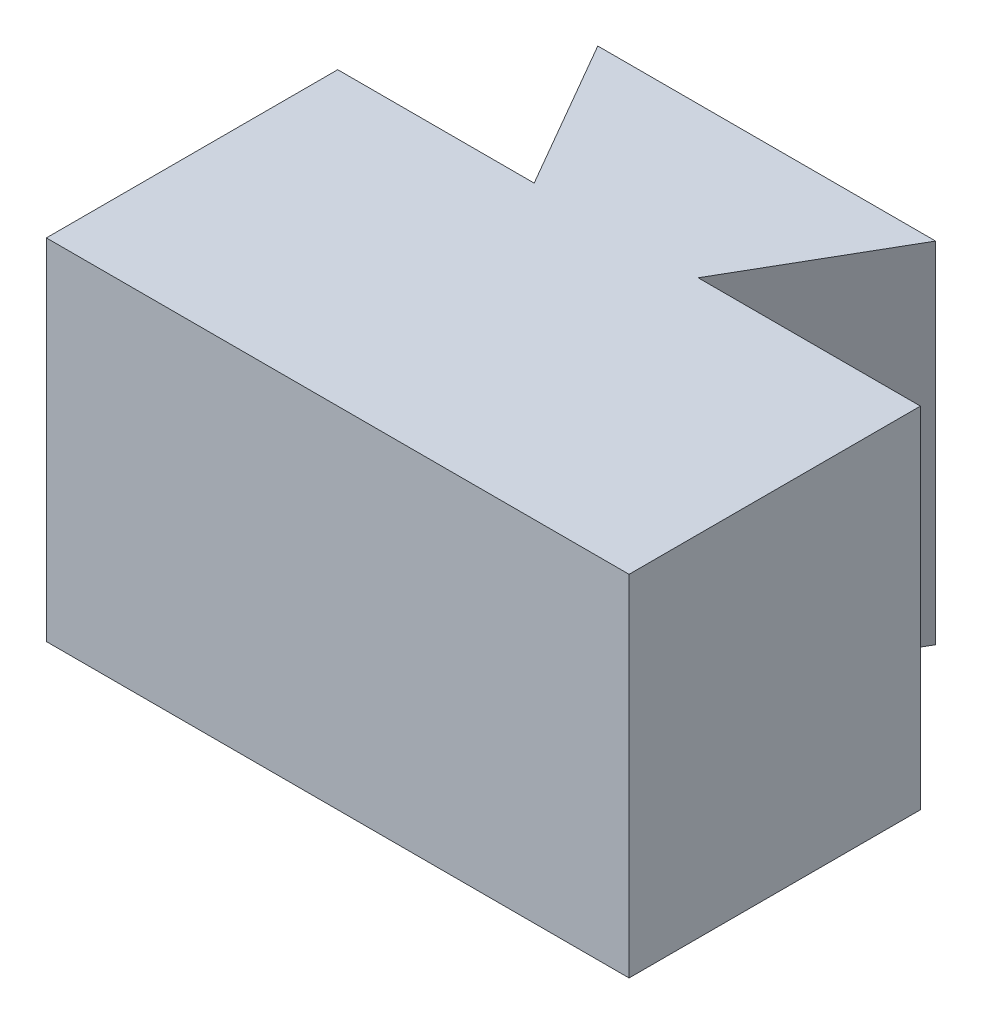
ISO-10303-21;
HEADER;
FILE_DESCRIPTION(('STEP AP214'),'2;1');
FILE_NAME('part.step','',(''),(''),'','','');
FILE_SCHEMA(('AUTOMOTIVE_DESIGN { 1 0 10303 214 1 1 1 1 }'));
ENDSEC;
DATA;
#1=APPLICATION_CONTEXT('core data for automotive mechanical design processes');
#2=APPLICATION_PROTOCOL_DEFINITION('international standard','automotive_design',2000,#1);
#3=PRODUCT_CONTEXT('',#1,'mechanical');
#4=PRODUCT('Part','Part','',(#3));
#5=PRODUCT_RELATED_PRODUCT_CATEGORY('part','',(#4));
#6=PRODUCT_DEFINITION_FORMATION('','',#4);
#7=PRODUCT_DEFINITION_CONTEXT('part definition',#1,'design');
#8=PRODUCT_DEFINITION('design','',#6,#7);
#9=PRODUCT_DEFINITION_SHAPE('','',#8);
#10=(LENGTH_UNIT() NAMED_UNIT(*) SI_UNIT(.MILLI.,.METRE.));
#11=(NAMED_UNIT(*) PLANE_ANGLE_UNIT() SI_UNIT($,.RADIAN.));
#12=(NAMED_UNIT(*) SI_UNIT($,.STERADIAN.) SOLID_ANGLE_UNIT());
#13=UNCERTAINTY_MEASURE_WITH_UNIT(LENGTH_MEASURE(1.E-05),#10,'distance_accuracy_value','');
#14=(GEOMETRIC_REPRESENTATION_CONTEXT(3) GLOBAL_UNCERTAINTY_ASSIGNED_CONTEXT((#13)) GLOBAL_UNIT_ASSIGNED_CONTEXT((#10,
#11,#12)) REPRESENTATION_CONTEXT('',''));
#15=CARTESIAN_POINT('',(0.,0.,0.));
#16=DIRECTION('',(0.,0.,1.));
#17=DIRECTION('',(1.,0.,0.));
#18=AXIS2_PLACEMENT_3D('',#15,#16,#17);
#19=CARTESIAN_POINT('',(-8.1439266494471,-0.00999999999999959,0.));
#20=DIRECTION('',(-0.866025403784436,0.,0.500000000000004));
#21=DIRECTION('',(0.500000000000004,0.,0.866025403784436));
#22=AXIS2_PLACEMENT_3D('',#19,#20,#21);
#23=PLANE('',#22);
#24=DIRECTION('',(0.,1.,0.));
#25=VECTOR('',#24,1.);
#26=CARTESIAN_POINT('',(-15.6020026458164,-0.00999999999999959,-12.9177665524214));
#27=LINE('',#26,#25);
#28=CARTESIAN_POINT('',(-15.6020026458164,0.,-12.9177665524214));
#29=VERTEX_POINT('',#28);
#30=CARTESIAN_POINT('',(-15.6020026458164,30.,-12.9177665524214));
#31=VERTEX_POINT('',#30);
#32=EDGE_CURVE('E11',#29,#31,#27,.T.);
#33=ORIENTED_EDGE('',*,*,#32,.F.);
#34=DIRECTION('',(0.500000000000004,0.,0.866025403784436));
#35=VECTOR('',#34,1.);
#36=CARTESIAN_POINT('',(-6.10794498708529,0.,3.52642368248916));
#37=LINE('',#36,#35);
#38=CARTESIAN_POINT('',(-8.1439266494471,0.,0.));
#39=VERTEX_POINT('',#38);
#40=EDGE_CURVE('E159',#29,#39,#37,.T.);
#41=ORIENTED_EDGE('',*,*,#40,.T.);
#42=DIRECTION('',(0.,1.,0.));
#43=VECTOR('',#42,1.);
#44=CARTESIAN_POINT('',(-8.1439266494471,-0.00999999999999959,0.));
#45=LINE('',#44,#43);
#46=CARTESIAN_POINT('',(-8.1439266494471,30.,0.));
#47=VERTEX_POINT('',#46);
#48=EDGE_CURVE('E56',#39,#47,#45,.T.);
#49=ORIENTED_EDGE('',*,*,#48,.T.);
#50=DIRECTION('',(0.500000000000004,0.,0.866025403784436));
#51=VECTOR('',#50,1.);
#52=CARTESIAN_POINT('',(-6.10794498708529,30.,3.52642368248916));
#53=LINE('',#52,#51);
#54=EDGE_CURVE('E184',#31,#47,#53,.T.);
#55=ORIENTED_EDGE('',*,*,#54,.F.);
#56=EDGE_LOOP('',(#33,#41,#49,#55));
#57=FACE_BOUND('',#56,.T.);
#58=ADVANCED_FACE('F45',(#57),#23,.T.);
#59=CARTESIAN_POINT('',(-15.6020026458164,-0.00999999999999959,-12.9177665524214));
#60=DIRECTION('',(0.,0.,-1.));
#61=DIRECTION('',(-1.,0.,0.));
#62=AXIS2_PLACEMENT_3D('',#59,#60,#61);
#63=PLANE('',#62);
#64=DIRECTION('',(0.,1.,0.));
#65=VECTOR('',#64,1.);
#66=CARTESIAN_POINT('',(13.3868545971668,-0.00999999999999959,-12.9177665524214));
#67=LINE('',#66,#65);
#68=CARTESIAN_POINT('',(13.3868545971668,0.,-12.9177665524214));
#69=VERTEX_POINT('',#68);
#70=CARTESIAN_POINT('',(13.3868545971668,30.,-12.9177665524214));
#71=VERTEX_POINT('',#70);
#72=EDGE_CURVE('E179',#69,#71,#67,.T.);
#73=ORIENTED_EDGE('',*,*,#72,.F.);
#74=DIRECTION('',(-1.,0.,0.));
#75=VECTOR('',#74,1.);
#76=CARTESIAN_POINT('',(0.,0.,-12.9177665524214));
#77=LINE('',#76,#75);
#78=EDGE_CURVE('E152',#69,#29,#77,.T.);
#79=ORIENTED_EDGE('',*,*,#78,.T.);
#80=ORIENTED_EDGE('',*,*,#32,.T.);
#81=DIRECTION('',(-1.,0.,0.));
#82=VECTOR('',#81,1.);
#83=CARTESIAN_POINT('',(0.,30.,-12.9177665524214));
#84=LINE('',#83,#82);
#85=EDGE_CURVE('E189',#71,#31,#84,.T.);
#86=ORIENTED_EDGE('',*,*,#85,.F.);
#87=EDGE_LOOP('',(#73,#79,#80,#86));
#88=FACE_BOUND('',#87,.T.);
#89=ADVANCED_FACE('F209',(#88),#63,.T.);
#90=CARTESIAN_POINT('',(-8.1439266494471,-0.00999999999999959,0.));
#91=DIRECTION('',(0.,0.,-1.));
#92=DIRECTION('',(-1.,0.,0.));
#93=AXIS2_PLACEMENT_3D('',#90,#91,#92);
#94=PLANE('',#93);
#95=ORIENTED_EDGE('',*,*,#48,.F.);
#96=DIRECTION('',(-1.,0.,0.));
#97=VECTOR('',#96,1.);
#98=CARTESIAN_POINT('',(0.,0.,0.));
#99=LINE('',#98,#97);
#100=CARTESIAN_POINT('',(-25.,0.,0.));
#101=VERTEX_POINT('',#100);
#102=EDGE_CURVE('E146',#39,#101,#99,.T.);
#103=ORIENTED_EDGE('',*,*,#102,.T.);
#104=DIRECTION('',(0.,1.,0.));
#105=VECTOR('',#104,1.);
#106=CARTESIAN_POINT('',(-25.,-0.00999999999999959,0.));
#107=LINE('',#106,#105);
#108=CARTESIAN_POINT('',(-25.,30.,0.));
#109=VERTEX_POINT('',#108);
#110=EDGE_CURVE('E137',#101,#109,#107,.T.);
#111=ORIENTED_EDGE('',*,*,#110,.T.);
#112=DIRECTION('',(-1.,0.,0.));
#113=VECTOR('',#112,1.);
#114=CARTESIAN_POINT('',(0.,30.,0.));
#115=LINE('',#114,#113);
#116=EDGE_CURVE('E136',#47,#109,#115,.T.);
#117=ORIENTED_EDGE('',*,*,#116,.F.);
#118=EDGE_LOOP('',(#95,#103,#111,#117));
#119=FACE_BOUND('',#118,.T.);
#120=ADVANCED_FACE('F205',(#119),#94,.T.);
#121=CARTESIAN_POINT('',(13.3868545971668,-0.00999999999999959,-12.9177665524214));
#122=DIRECTION('',(0.866025403784436,0.,0.500000000000004));
#123=DIRECTION('',(0.500000000000004,0.,-0.866025403784436));
#124=AXIS2_PLACEMENT_3D('',#121,#122,#123);
#125=PLANE('',#124);
#126=DIRECTION('',(0.,1.,0.));
#127=VECTOR('',#126,1.);
#128=CARTESIAN_POINT('',(5.92877860079748,-0.00999999999999959,0.));
#129=LINE('',#128,#127);
#130=CARTESIAN_POINT('',(5.92877860079748,0.,0.));
#131=VERTEX_POINT('',#130);
#132=CARTESIAN_POINT('',(5.92877860079748,30.,0.));
#133=VERTEX_POINT('',#132);
#134=EDGE_CURVE('E128',#131,#133,#129,.T.);
#135=ORIENTED_EDGE('',*,*,#134,.F.);
#136=DIRECTION('',(0.500000000000004,0.,-0.866025403784436));
#137=VECTOR('',#136,1.);
#138=CARTESIAN_POINT('',(4.44658395059808,0.,2.5672364408521));
#139=LINE('',#138,#137);
#140=EDGE_CURVE('E144',#131,#69,#139,.T.);
#141=ORIENTED_EDGE('',*,*,#140,.T.);
#142=ORIENTED_EDGE('',*,*,#72,.T.);
#143=DIRECTION('',(0.500000000000004,0.,-0.866025403784436));
#144=VECTOR('',#143,1.);
#145=CARTESIAN_POINT('',(4.44658395059808,30.,2.5672364408521));
#146=LINE('',#145,#144);
#147=EDGE_CURVE('E193',#133,#71,#146,.T.);
#148=ORIENTED_EDGE('',*,*,#147,.F.);
#149=EDGE_LOOP('',(#135,#141,#142,#148));
#150=FACE_BOUND('',#149,.T.);
#151=ADVANCED_FACE('F212',(#150),#125,.T.);
#152=CARTESIAN_POINT('',(5.92877860079748,-0.00999999999999959,0.));
#153=DIRECTION('',(0.,0.,-1.));
#154=DIRECTION('',(-1.,0.,0.));
#155=AXIS2_PLACEMENT_3D('',#152,#153,#154);
#156=PLANE('',#155);
#157=DIRECTION('',(0.,-1.,0.));
#158=VECTOR('',#157,1.);
#159=CARTESIAN_POINT('',(25.,30.,0.));
#160=LINE('',#159,#158);
#161=CARTESIAN_POINT('',(25.,30.,0.));
#162=VERTEX_POINT('',#161);
#163=CARTESIAN_POINT('',(25.,0.,0.));
#164=VERTEX_POINT('',#163);
#165=EDGE_CURVE('E122',#162,#164,#160,.T.);
#166=ORIENTED_EDGE('',*,*,#165,.T.);
#167=DIRECTION('',(-1.,0.,0.));
#168=VECTOR('',#167,1.);
#169=CARTESIAN_POINT('',(0.,0.,0.));
#170=LINE('',#169,#168);
#171=EDGE_CURVE('E132',#164,#131,#170,.T.);
#172=ORIENTED_EDGE('',*,*,#171,.T.);
#173=ORIENTED_EDGE('',*,*,#134,.T.);
#174=DIRECTION('',(-1.,0.,0.));
#175=VECTOR('',#174,1.);
#176=CARTESIAN_POINT('',(0.,30.,0.));
#177=LINE('',#176,#175);
#178=EDGE_CURVE('E134',#162,#133,#177,.T.);
#179=ORIENTED_EDGE('',*,*,#178,.F.);
#180=EDGE_LOOP('',(#166,#172,#173,#179));
#181=FACE_BOUND('',#180,.T.);
#182=ADVANCED_FACE('F131',(#181),#156,.T.);
#183=CARTESIAN_POINT('',(0.,0.,0.));
#184=DIRECTION('',(0.,1.,0.));
#185=DIRECTION('',(0.,0.,1.));
#186=AXIS2_PLACEMENT_3D('',#183,#184,#185);
#187=PLANE('',#186);
#188=ORIENTED_EDGE('',*,*,#102,.F.);
#189=ORIENTED_EDGE('',*,*,#40,.F.);
#190=ORIENTED_EDGE('',*,*,#78,.F.);
#191=ORIENTED_EDGE('',*,*,#140,.F.);
#192=ORIENTED_EDGE('',*,*,#171,.F.);
#193=DIRECTION('',(0.,0.,-1.));
#194=VECTOR('',#193,1.);
#195=CARTESIAN_POINT('',(25.,0.,-25.));
#196=LINE('',#195,#194);
#197=CARTESIAN_POINT('',(25.,0.,25.));
#198=VERTEX_POINT('',#197);
#199=EDGE_CURVE('E49',#198,#164,#196,.T.);
#200=ORIENTED_EDGE('',*,*,#199,.F.);
#201=DIRECTION('',(1.,0.,0.));
#202=VECTOR('',#201,1.);
#203=CARTESIAN_POINT('',(-25.,0.,25.));
#204=LINE('',#203,#202);
#205=CARTESIAN_POINT('',(-25.,0.,25.));
#206=VERTEX_POINT('',#205);
#207=EDGE_CURVE('E167',#206,#198,#204,.T.);
#208=ORIENTED_EDGE('',*,*,#207,.F.);
#209=DIRECTION('',(0.,0.,1.));
#210=VECTOR('',#209,1.);
#211=CARTESIAN_POINT('',(-25.,0.,-25.));
#212=LINE('',#211,#210);
#213=EDGE_CURVE('E65',#101,#206,#212,.T.);
#214=ORIENTED_EDGE('',*,*,#213,.F.);
#215=EDGE_LOOP('',(#188,#189,#190,#191,#192,#200,#208,#214));
#216=FACE_BOUND('',#215,.T.);
#217=ADVANCED_FACE('F141',(#216),#187,.F.);
#218=CARTESIAN_POINT('',(25.,30.,-25.));
#219=DIRECTION('',(-1.,0.,0.));
#220=DIRECTION('',(0.,0.,1.));
#221=AXIS2_PLACEMENT_3D('',#218,#219,#220);
#222=PLANE('',#221);
#223=ORIENTED_EDGE('',*,*,#165,.F.);
#224=DIRECTION('',(0.,0.,-1.));
#225=VECTOR('',#224,1.);
#226=CARTESIAN_POINT('',(25.,30.,-25.));
#227=LINE('',#226,#225);
#228=CARTESIAN_POINT('',(25.,30.,25.));
#229=VERTEX_POINT('',#228);
#230=EDGE_CURVE('E165',#229,#162,#227,.T.);
#231=ORIENTED_EDGE('',*,*,#230,.F.);
#232=DIRECTION('',(0.,-1.,0.));
#233=VECTOR('',#232,1.);
#234=CARTESIAN_POINT('',(25.,30.,25.));
#235=LINE('',#234,#233);
#236=EDGE_CURVE('E123',#229,#198,#235,.T.);
#237=ORIENTED_EDGE('',*,*,#236,.T.);
#238=ORIENTED_EDGE('',*,*,#199,.T.);
#239=EDGE_LOOP('',(#223,#231,#237,#238));
#240=FACE_BOUND('',#239,.T.);
#241=ADVANCED_FACE('F120',(#240),#222,.F.);
#242=CARTESIAN_POINT('',(-25.,30.,25.));
#243=DIRECTION('',(0.,0.,-1.));
#244=DIRECTION('',(-1.,0.,0.));
#245=AXIS2_PLACEMENT_3D('',#242,#243,#244);
#246=PLANE('',#245);
#247=ORIENTED_EDGE('',*,*,#207,.T.);
#248=ORIENTED_EDGE('',*,*,#236,.F.);
#249=DIRECTION('',(1.,0.,0.));
#250=VECTOR('',#249,1.);
#251=CARTESIAN_POINT('',(-25.,30.,25.));
#252=LINE('',#251,#250);
#253=CARTESIAN_POINT('',(-25.,30.,25.));
#254=VERTEX_POINT('',#253);
#255=EDGE_CURVE('E77',#254,#229,#252,.T.);
#256=ORIENTED_EDGE('',*,*,#255,.F.);
#257=DIRECTION('',(0.,-1.,0.));
#258=VECTOR('',#257,1.);
#259=CARTESIAN_POINT('',(-25.,30.,25.));
#260=LINE('',#259,#258);
#261=EDGE_CURVE('E188',#254,#206,#260,.T.);
#262=ORIENTED_EDGE('',*,*,#261,.T.);
#263=EDGE_LOOP('',(#247,#248,#256,#262));
#264=FACE_BOUND('',#263,.T.);
#265=ADVANCED_FACE('F227',(#264),#246,.F.);
#266=CARTESIAN_POINT('',(-25.,30.,-25.));
#267=DIRECTION('',(1.,0.,0.));
#268=DIRECTION('',(0.,0.,-1.));
#269=AXIS2_PLACEMENT_3D('',#266,#267,#268);
#270=PLANE('',#269);
#271=ORIENTED_EDGE('',*,*,#110,.F.);
#272=ORIENTED_EDGE('',*,*,#213,.T.);
#273=ORIENTED_EDGE('',*,*,#261,.F.);
#274=DIRECTION('',(0.,0.,1.));
#275=VECTOR('',#274,1.);
#276=CARTESIAN_POINT('',(-25.,30.,-25.));
#277=LINE('',#276,#275);
#278=EDGE_CURVE('E162',#109,#254,#277,.T.);
#279=ORIENTED_EDGE('',*,*,#278,.F.);
#280=EDGE_LOOP('',(#271,#272,#273,#279));
#281=FACE_BOUND('',#280,.T.);
#282=ADVANCED_FACE('F206',(#281),#270,.F.);
#283=CARTESIAN_POINT('',(0.,30.,0.));
#284=DIRECTION('',(0.,1.,0.));
#285=DIRECTION('',(0.,0.,1.));
#286=AXIS2_PLACEMENT_3D('',#283,#284,#285);
#287=PLANE('',#286);
#288=ORIENTED_EDGE('',*,*,#54,.T.);
#289=ORIENTED_EDGE('',*,*,#116,.T.);
#290=ORIENTED_EDGE('',*,*,#278,.T.);
#291=ORIENTED_EDGE('',*,*,#255,.T.);
#292=ORIENTED_EDGE('',*,*,#230,.T.);
#293=ORIENTED_EDGE('',*,*,#178,.T.);
#294=ORIENTED_EDGE('',*,*,#147,.T.);
#295=ORIENTED_EDGE('',*,*,#85,.T.);
#296=EDGE_LOOP('',(#288,#289,#290,#291,#292,#293,#294,#295));
#297=FACE_BOUND('',#296,.T.);
#298=ADVANCED_FACE('F47',(#297),#287,.T.);
#299=CLOSED_SHELL('',(#58,#89,#120,#151,#182,#217,#241,#265,#282,#298));
#300=MANIFOLD_SOLID_BREP('B2',#299);
#301=ADVANCED_BREP_SHAPE_REPRESENTATION('',(#18,#300),#14);
#302=SHAPE_DEFINITION_REPRESENTATION(#9,#301);
ENDSEC;
END-ISO-10303-21;
